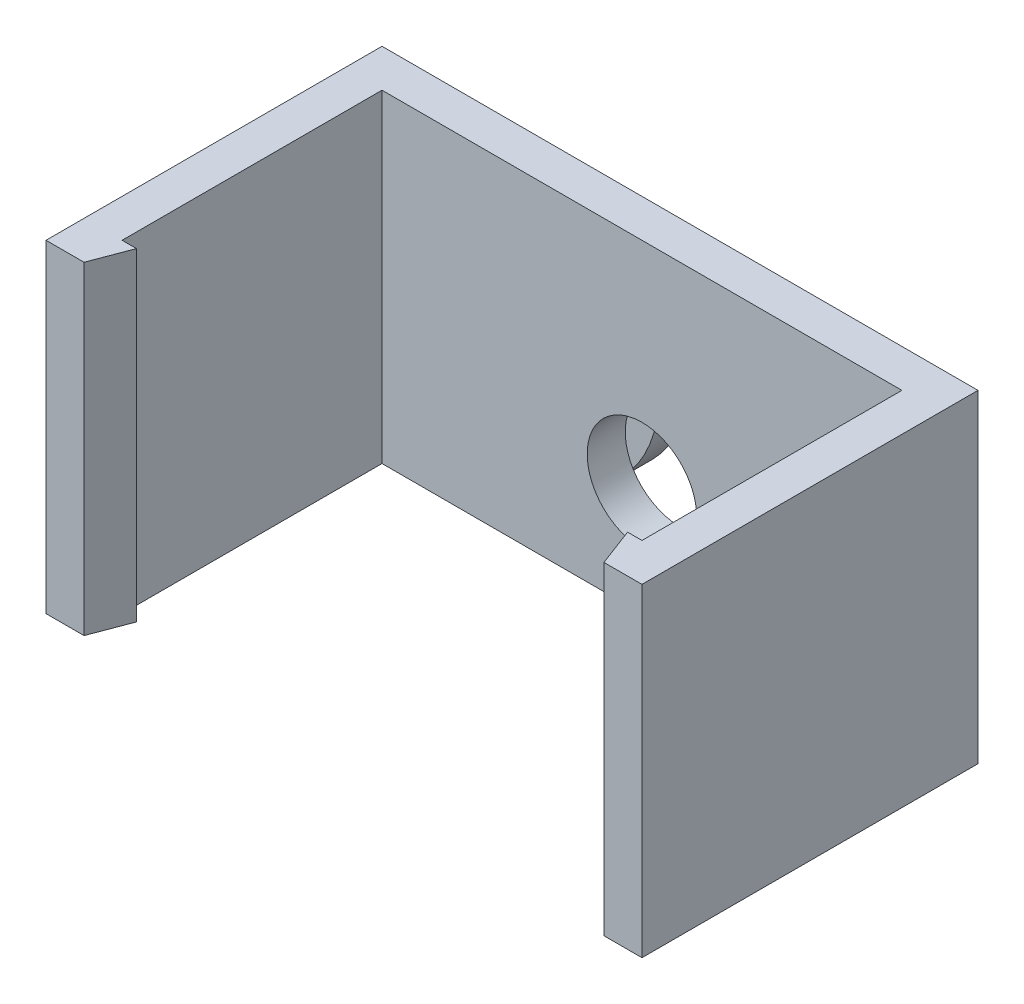
ISO-10303-21;
HEADER;
FILE_DESCRIPTION(('STEP AP214'),'2;1');
FILE_NAME('part.step','',(''),(''),'','','');
FILE_SCHEMA(('AUTOMOTIVE_DESIGN { 1 0 10303 214 1 1 1 1 }'));
ENDSEC;
DATA;
#1=APPLICATION_CONTEXT('core data for automotive mechanical design processes');
#2=APPLICATION_PROTOCOL_DEFINITION('international standard','automotive_design',2000,#1);
#3=PRODUCT_CONTEXT('',#1,'mechanical');
#4=PRODUCT('Part','Part','',(#3));
#5=PRODUCT_RELATED_PRODUCT_CATEGORY('part','',(#4));
#6=PRODUCT_DEFINITION_FORMATION('','',#4);
#7=PRODUCT_DEFINITION_CONTEXT('part definition',#1,'design');
#8=PRODUCT_DEFINITION('design','',#6,#7);
#9=PRODUCT_DEFINITION_SHAPE('','',#8);
#10=(LENGTH_UNIT() NAMED_UNIT(*) SI_UNIT(.MILLI.,.METRE.));
#11=(NAMED_UNIT(*) PLANE_ANGLE_UNIT() SI_UNIT($,.RADIAN.));
#12=(NAMED_UNIT(*) SI_UNIT($,.STERADIAN.) SOLID_ANGLE_UNIT());
#13=UNCERTAINTY_MEASURE_WITH_UNIT(LENGTH_MEASURE(1.E-05),#10,'distance_accuracy_value','');
#14=(GEOMETRIC_REPRESENTATION_CONTEXT(3) GLOBAL_UNCERTAINTY_ASSIGNED_CONTEXT((#13)) GLOBAL_UNIT_ASSIGNED_CONTEXT((#10,
#11,#12)) REPRESENTATION_CONTEXT('',''));
#15=CARTESIAN_POINT('',(0.,0.,0.));
#16=DIRECTION('',(0.,0.,1.));
#17=DIRECTION('',(1.,0.,0.));
#18=AXIS2_PLACEMENT_3D('',#15,#16,#17);
#19=CARTESIAN_POINT('',(-27.8509607345382,23.,-13.25));
#20=DIRECTION('',(0.,1.,0.));
#21=DIRECTION('',(0.,0.,1.));
#22=AXIS2_PLACEMENT_3D('',#19,#20,#21);
#23=PLANE('',#22);
#24=DIRECTION('',(-1.,0.,0.));
#25=VECTOR('',#24,1.);
#26=CARTESIAN_POINT('',(-17.1490392654618,23.,-15.85));
#27=LINE('',#26,#25);
#28=CARTESIAN_POINT('',(17.1490392654618,23.,-15.85));
#29=VERTEX_POINT('',#28);
#30=CARTESIAN_POINT('',(-17.1490392654618,23.,-15.85));
#31=VERTEX_POINT('',#30);
#32=EDGE_CURVE('E327',#29,#31,#27,.T.);
#33=ORIENTED_EDGE('',*,*,#32,.F.);
#34=DIRECTION('',(0.,0.,1.));
#35=VECTOR('',#34,1.);
#36=CARTESIAN_POINT('',(17.1490392654618,23.,-13.25));
#37=LINE('',#36,#35);
#38=CARTESIAN_POINT('',(17.1490392654618,23.,-13.25));
#39=VERTEX_POINT('',#38);
#40=EDGE_CURVE('E295',#29,#39,#37,.T.);
#41=ORIENTED_EDGE('',*,*,#40,.T.);
#42=DIRECTION('',(1.,0.,0.));
#43=VECTOR('',#42,1.);
#44=CARTESIAN_POINT('',(-27.8509607345382,23.,-13.25));
#45=LINE('',#44,#43);
#46=CARTESIAN_POINT('',(-17.1490392654618,23.,-13.25));
#47=VERTEX_POINT('',#46);
#48=EDGE_CURVE('E289',#47,#39,#45,.T.);
#49=ORIENTED_EDGE('',*,*,#48,.F.);
#50=DIRECTION('',(0.,0.,1.));
#51=VECTOR('',#50,1.);
#52=CARTESIAN_POINT('',(-17.1490392654618,23.,-23.25));
#53=LINE('',#52,#51);
#54=EDGE_CURVE('E290',#31,#47,#53,.T.);
#55=ORIENTED_EDGE('',*,*,#54,.F.);
#56=EDGE_LOOP('',(#33,#41,#49,#55));
#57=FACE_BOUND('',#56,.T.);
#58=ADVANCED_FACE('F32',(#57),#23,.F.);
#59=CARTESIAN_POINT('',(17.1490392654618,5.49999999999999,-23.25));
#60=DIRECTION('',(0.,1.,0.));
#61=DIRECTION('',(0.,0.,1.));
#62=AXIS2_PLACEMENT_3D('',#59,#60,#61);
#63=PLANE('',#62);
#64=DIRECTION('',(0.,0.,1.));
#65=VECTOR('',#64,1.);
#66=CARTESIAN_POINT('',(14.2647927675116,5.49999999999999,-23.25));
#67=LINE('',#66,#65);
#68=CARTESIAN_POINT('',(14.2647927675117,5.49999999999999,-15.85));
#69=VERTEX_POINT('',#68);
#70=CARTESIAN_POINT('',(14.2647927675116,5.49999999999999,-18.25));
#71=VERTEX_POINT('',#70);
#72=EDGE_CURVE('E198',#69,#71,#67,.F.);
#73=ORIENTED_EDGE('',*,*,#72,.T.);
#74=DIRECTION('',(1.,0.,0.));
#75=VECTOR('',#74,1.);
#76=CARTESIAN_POINT('',(-22.2509607345382,5.49999999999999,-18.25));
#77=LINE('',#76,#75);
#78=CARTESIAN_POINT('',(17.1490392654618,5.49999999999999,-18.25));
#79=VERTEX_POINT('',#78);
#80=EDGE_CURVE('E184',#71,#79,#77,.T.);
#81=ORIENTED_EDGE('',*,*,#80,.T.);
#82=DIRECTION('',(0.,0.,1.));
#83=VECTOR('',#82,1.);
#84=CARTESIAN_POINT('',(17.1490392654618,5.49999999999999,-23.25));
#85=LINE('',#84,#83);
#86=CARTESIAN_POINT('',(17.1490392654618,5.49999999999999,-15.85));
#87=VERTEX_POINT('',#86);
#88=EDGE_CURVE('E196',#79,#87,#85,.T.);
#89=ORIENTED_EDGE('',*,*,#88,.T.);
#90=DIRECTION('',(1.,0.,0.));
#91=VECTOR('',#90,1.);
#92=CARTESIAN_POINT('',(17.1490392654618,5.49999999999999,-15.85));
#93=LINE('',#92,#91);
#94=EDGE_CURVE('E331',#69,#87,#93,.T.);
#95=ORIENTED_EDGE('',*,*,#94,.F.);
#96=EDGE_LOOP('',(#73,#81,#89,#95));
#97=FACE_BOUND('',#96,.T.);
#98=ADVANCED_FACE('F194',(#97),#63,.F.);
#99=CARTESIAN_POINT('',(-23.5,31.,-13.25));
#100=DIRECTION('',(0.,0.,1.));
#101=DIRECTION('',(1.,0.,0.));
#102=AXIS2_PLACEMENT_3D('',#99,#100,#101);
#103=PLANE('',#102);
#104=CARTESIAN_POINT('',(0.,14.25,-13.25));
#105=DIRECTION('',(0.,0.,1.));
#106=DIRECTION('',(1.,0.,0.));
#107=AXIS2_PLACEMENT_3D('',#104,#105,#106);
#108=CIRCLE('',#107,4.31945574035728);
#109=CARTESIAN_POINT('',(4.31945574035728,14.25,-13.25));
#110=VERTEX_POINT('',#109);
#111=EDGE_CURVE('E297',#110,#110,#108,.F.);
#112=ORIENTED_EDGE('',*,*,#111,.F.);
#113=EDGE_LOOP('',(#112));
#114=FACE_BOUND('',#113,.T.);
#115=DIRECTION('',(0.,-1.,0.));
#116=VECTOR('',#115,1.);
#117=CARTESIAN_POINT('',(23.5,31.,-13.25));
#118=LINE('',#117,#116);
#119=CARTESIAN_POINT('',(23.5,31.,-13.25));
#120=VERTEX_POINT('',#119);
#121=CARTESIAN_POINT('',(23.5,5.49999999999999,-13.25));
#122=VERTEX_POINT('',#121);
#123=EDGE_CURVE('E259',#120,#122,#118,.T.);
#124=ORIENTED_EDGE('',*,*,#123,.T.);
#125=DIRECTION('',(1.,0.,0.));
#126=VECTOR('',#125,1.);
#127=CARTESIAN_POINT('',(-31.5,5.49999999999999,-13.25));
#128=LINE('',#127,#126);
#129=CARTESIAN_POINT('',(-23.5,5.49999999999999,-13.25));
#130=VERTEX_POINT('',#129);
#131=EDGE_CURVE('E320',#130,#122,#128,.T.);
#132=ORIENTED_EDGE('',*,*,#131,.F.);
#133=DIRECTION('',(0.,-1.,0.));
#134=VECTOR('',#133,1.);
#135=CARTESIAN_POINT('',(-23.5,31.,-13.25));
#136=LINE('',#135,#134);
#137=CARTESIAN_POINT('',(-23.5,31.,-13.25));
#138=VERTEX_POINT('',#137);
#139=EDGE_CURVE('E268',#138,#130,#136,.T.);
#140=ORIENTED_EDGE('',*,*,#139,.F.);
#141=DIRECTION('',(-1.,0.,0.));
#142=VECTOR('',#141,1.);
#143=CARTESIAN_POINT('',(-23.5,31.,-13.25));
#144=LINE('',#143,#142);
#145=EDGE_CURVE('E248',#120,#138,#144,.T.);
#146=ORIENTED_EDGE('',*,*,#145,.F.);
#147=EDGE_LOOP('',(#124,#132,#140,#146));
#148=FACE_BOUND('',#147,.T.);
#149=DIRECTION('',(0.,-1.,0.));
#150=VECTOR('',#149,1.);
#151=CARTESIAN_POINT('',(17.1490392654618,5.49999999999999,-13.25));
#152=LINE('',#151,#150);
#153=CARTESIAN_POINT('',(17.1490392654618,30.5,-13.25));
#154=VERTEX_POINT('',#153);
#155=EDGE_CURVE('E47',#154,#39,#152,.T.);
#156=ORIENTED_EDGE('',*,*,#155,.F.);
#157=DIRECTION('',(1.,0.,0.));
#158=VECTOR('',#157,1.);
#159=CARTESIAN_POINT('',(-17.1490392654618,30.5,-13.25));
#160=LINE('',#159,#158);
#161=CARTESIAN_POINT('',(-17.1490392654618,30.5,-13.25));
#162=VERTEX_POINT('',#161);
#163=EDGE_CURVE('E283',#154,#162,#160,.F.);
#164=ORIENTED_EDGE('',*,*,#163,.T.);
#165=DIRECTION('',(0.,1.,0.));
#166=VECTOR('',#165,1.);
#167=CARTESIAN_POINT('',(-17.1490392654618,5.49999999999999,-13.25));
#168=LINE('',#167,#166);
#169=EDGE_CURVE('E54',#47,#162,#168,.T.);
#170=ORIENTED_EDGE('',*,*,#169,.F.);
#171=ORIENTED_EDGE('',*,*,#48,.T.);
#172=EDGE_LOOP('',(#156,#164,#170,#171));
#173=FACE_BOUND('',#172,.T.);
#174=ADVANCED_FACE('F287',(#114,#148,#173),#103,.F.);
#175=CARTESIAN_POINT('',(0.,31.,0.));
#176=DIRECTION('',(0.,-1.,0.));
#177=DIRECTION('',(0.,0.,-1.));
#178=AXIS2_PLACEMENT_3D('',#175,#176,#177);
#179=PLANE('',#178);
#180=DIRECTION('',(0.353543073980112,0.,-0.935418245941725));
#181=VECTOR('',#180,1.);
#182=CARTESIAN_POINT('',(-13.5557335360472,31.,-5.12341482024928));
#183=LINE('',#182,#181);
#184=CARTESIAN_POINT('',(-20.5,31.,13.25));
#185=VERTEX_POINT('',#184);
#186=CARTESIAN_POINT('',(-19.3661443941875,31.,10.25));
#187=VERTEX_POINT('',#186);
#188=EDGE_CURVE('E210',#185,#187,#183,.T.);
#189=ORIENTED_EDGE('',*,*,#188,.T.);
#190=DIRECTION('',(1.,0.,0.));
#191=VECTOR('',#190,1.);
#192=CARTESIAN_POINT('',(-20.5,31.,10.25));
#193=LINE('',#192,#191);
#194=CARTESIAN_POINT('',(-20.5,31.,10.25));
#195=VERTEX_POINT('',#194);
#196=EDGE_CURVE('E233',#195,#187,#193,.T.);
#197=ORIENTED_EDGE('',*,*,#196,.F.);
#198=DIRECTION('',(0.,0.,1.));
#199=VECTOR('',#198,1.);
#200=CARTESIAN_POINT('',(-20.5,31.,-10.25));
#201=LINE('',#200,#199);
#202=CARTESIAN_POINT('',(-20.5,31.,-10.25));
#203=VERTEX_POINT('',#202);
#204=EDGE_CURVE('E229',#203,#195,#201,.T.);
#205=ORIENTED_EDGE('',*,*,#204,.F.);
#206=DIRECTION('',(-1.,0.,0.));
#207=VECTOR('',#206,1.);
#208=CARTESIAN_POINT('',(-20.5,31.,-10.25));
#209=LINE('',#208,#207);
#210=CARTESIAN_POINT('',(20.5,31.,-10.25));
#211=VERTEX_POINT('',#210);
#212=EDGE_CURVE('E227',#211,#203,#209,.T.);
#213=ORIENTED_EDGE('',*,*,#212,.F.);
#214=DIRECTION('',(0.,0.,-1.));
#215=VECTOR('',#214,1.);
#216=CARTESIAN_POINT('',(20.5,31.,-10.25));
#217=LINE('',#216,#215);
#218=CARTESIAN_POINT('',(20.5,31.,10.25));
#219=VERTEX_POINT('',#218);
#220=EDGE_CURVE('E220',#219,#211,#217,.T.);
#221=ORIENTED_EDGE('',*,*,#220,.F.);
#222=CARTESIAN_POINT('',(19.3661443941875,31.,10.25));
#223=VERTEX_POINT('',#222);
#224=EDGE_CURVE('E232',#223,#219,#193,.T.);
#225=ORIENTED_EDGE('',*,*,#224,.F.);
#226=DIRECTION('',(-0.353543073980112,0.,-0.935418245941725));
#227=VECTOR('',#226,1.);
#228=CARTESIAN_POINT('',(13.5557335360472,31.,-5.12341482024927));
#229=LINE('',#228,#227);
#230=CARTESIAN_POINT('',(20.5,31.,13.25));
#231=VERTEX_POINT('',#230);
#232=EDGE_CURVE('E206',#231,#223,#229,.T.);
#233=ORIENTED_EDGE('',*,*,#232,.F.);
#234=DIRECTION('',(1.,0.,0.));
#235=VECTOR('',#234,1.);
#236=CARTESIAN_POINT('',(-23.5,31.,13.25));
#237=LINE('',#236,#235);
#238=CARTESIAN_POINT('',(23.5,31.,13.25));
#239=VERTEX_POINT('',#238);
#240=EDGE_CURVE('E253',#231,#239,#237,.T.);
#241=ORIENTED_EDGE('',*,*,#240,.T.);
#242=DIRECTION('',(0.,0.,-1.));
#243=VECTOR('',#242,1.);
#244=CARTESIAN_POINT('',(23.5,31.,-13.25));
#245=LINE('',#244,#243);
#246=EDGE_CURVE('E257',#239,#120,#245,.T.);
#247=ORIENTED_EDGE('',*,*,#246,.T.);
#248=ORIENTED_EDGE('',*,*,#145,.T.);
#249=DIRECTION('',(0.,0.,1.));
#250=VECTOR('',#249,1.);
#251=CARTESIAN_POINT('',(-23.5,31.,-13.25));
#252=LINE('',#251,#250);
#253=CARTESIAN_POINT('',(-23.5,31.,13.25));
#254=VERTEX_POINT('',#253);
#255=EDGE_CURVE('E251',#138,#254,#252,.T.);
#256=ORIENTED_EDGE('',*,*,#255,.T.);
#257=EDGE_CURVE('E254',#254,#185,#237,.T.);
#258=ORIENTED_EDGE('',*,*,#257,.T.);
#259=EDGE_LOOP('',(#189,#197,#205,#213,#221,#225,#233,#241,#247,#248,#256,#258));
#260=FACE_BOUND('',#259,.T.);
#261=ADVANCED_FACE('F419',(#260),#179,.F.);
#262=CARTESIAN_POINT('',(-23.5,31.,13.25));
#263=DIRECTION('',(0.,0.,-1.));
#264=DIRECTION('',(-1.,0.,0.));
#265=AXIS2_PLACEMENT_3D('',#262,#263,#264);
#266=PLANE('',#265);
#267=DIRECTION('',(0.,-1.,0.));
#268=VECTOR('',#267,1.);
#269=CARTESIAN_POINT('',(-23.5,31.,13.25));
#270=LINE('',#269,#268);
#271=CARTESIAN_POINT('',(-23.5,5.49999999999999,13.25));
#272=VERTEX_POINT('',#271);
#273=EDGE_CURVE('E265',#254,#272,#270,.T.);
#274=ORIENTED_EDGE('',*,*,#273,.T.);
#275=DIRECTION('',(1.,0.,0.));
#276=VECTOR('',#275,1.);
#277=CARTESIAN_POINT('',(-31.5,5.49999999999999,13.25));
#278=LINE('',#277,#276);
#279=CARTESIAN_POINT('',(-20.5,5.49999999999999,13.25));
#280=VERTEX_POINT('',#279);
#281=EDGE_CURVE('E319',#272,#280,#278,.T.);
#282=ORIENTED_EDGE('',*,*,#281,.T.);
#283=DIRECTION('',(0.,1.,0.));
#284=VECTOR('',#283,1.);
#285=CARTESIAN_POINT('',(-20.5,0.,13.25));
#286=LINE('',#285,#284);
#287=EDGE_CURVE('E218',#280,#185,#286,.T.);
#288=ORIENTED_EDGE('',*,*,#287,.T.);
#289=ORIENTED_EDGE('',*,*,#257,.F.);
#290=EDGE_LOOP('',(#274,#282,#288,#289));
#291=FACE_BOUND('',#290,.T.);
#292=ADVANCED_FACE('F422',(#291),#266,.F.);
#293=CARTESIAN_POINT('',(-20.5,31.,10.25));
#294=DIRECTION('',(0.,0.,-1.));
#295=DIRECTION('',(-1.,0.,0.));
#296=AXIS2_PLACEMENT_3D('',#293,#294,#295);
#297=PLANE('',#296);
#298=DIRECTION('',(1.,0.,0.));
#299=VECTOR('',#298,1.);
#300=CARTESIAN_POINT('',(-20.5,5.49999999999999,10.25));
#301=LINE('',#300,#299);
#302=CARTESIAN_POINT('',(-20.5,5.49999999999999,10.25));
#303=VERTEX_POINT('',#302);
#304=CARTESIAN_POINT('',(-19.3661443941875,5.49999999999999,10.25));
#305=VERTEX_POINT('',#304);
#306=EDGE_CURVE('E317',#303,#305,#301,.T.);
#307=ORIENTED_EDGE('',*,*,#306,.F.);
#308=DIRECTION('',(0.,-1.,0.));
#309=VECTOR('',#308,1.);
#310=CARTESIAN_POINT('',(-20.5,31.,10.25));
#311=LINE('',#310,#309);
#312=EDGE_CURVE('E239',#195,#303,#311,.T.);
#313=ORIENTED_EDGE('',*,*,#312,.F.);
#314=ORIENTED_EDGE('',*,*,#196,.T.);
#315=DIRECTION('',(0.,1.,0.));
#316=VECTOR('',#315,1.);
#317=CARTESIAN_POINT('',(-19.3661443941875,0.,10.25));
#318=LINE('',#317,#316);
#319=EDGE_CURVE('E221',#305,#187,#318,.T.);
#320=ORIENTED_EDGE('',*,*,#319,.F.);
#321=EDGE_LOOP('',(#307,#313,#314,#320));
#322=FACE_BOUND('',#321,.T.);
#323=ADVANCED_FACE('F406',(#322),#297,.T.);
#324=CARTESIAN_POINT('',(-23.5,31.,-13.25));
#325=DIRECTION('',(1.,0.,0.));
#326=DIRECTION('',(0.,0.,-1.));
#327=AXIS2_PLACEMENT_3D('',#324,#325,#326);
#328=PLANE('',#327);
#329=ORIENTED_EDGE('',*,*,#139,.T.);
#330=DIRECTION('',(0.,0.,1.));
#331=VECTOR('',#330,1.);
#332=CARTESIAN_POINT('',(-23.5,5.49999999999999,-13.25));
#333=LINE('',#332,#331);
#334=EDGE_CURVE('E303',#130,#272,#333,.T.);
#335=ORIENTED_EDGE('',*,*,#334,.T.);
#336=ORIENTED_EDGE('',*,*,#273,.F.);
#337=ORIENTED_EDGE('',*,*,#255,.F.);
#338=EDGE_LOOP('',(#329,#335,#336,#337));
#339=FACE_BOUND('',#338,.T.);
#340=ADVANCED_FACE('F430',(#339),#328,.F.);
#341=DIRECTION('',(0.,1.,0.));
#342=VECTOR('',#341,1.);
#343=CARTESIAN_POINT('',(20.5,0.,13.25));
#344=LINE('',#343,#342);
#345=CARTESIAN_POINT('',(20.5,5.49999999999999,13.25));
#346=VERTEX_POINT('',#345);
#347=EDGE_CURVE('E217',#346,#231,#344,.T.);
#348=ORIENTED_EDGE('',*,*,#347,.F.);
#349=CARTESIAN_POINT('',(23.5,5.49999999999999,13.25));
#350=VERTEX_POINT('',#349);
#351=EDGE_CURVE('E322',#346,#350,#278,.T.);
#352=ORIENTED_EDGE('',*,*,#351,.T.);
#353=DIRECTION('',(0.,-1.,0.));
#354=VECTOR('',#353,1.);
#355=CARTESIAN_POINT('',(23.5,31.,13.25));
#356=LINE('',#355,#354);
#357=EDGE_CURVE('E262',#239,#350,#356,.T.);
#358=ORIENTED_EDGE('',*,*,#357,.F.);
#359=ORIENTED_EDGE('',*,*,#240,.F.);
#360=EDGE_LOOP('',(#348,#352,#358,#359));
#361=FACE_BOUND('',#360,.T.);
#362=ADVANCED_FACE('F426',(#361),#266,.F.);
#363=CARTESIAN_POINT('',(23.5,31.,-13.25));
#364=DIRECTION('',(-1.,0.,0.));
#365=DIRECTION('',(0.,0.,1.));
#366=AXIS2_PLACEMENT_3D('',#363,#364,#365);
#367=PLANE('',#366);
#368=ORIENTED_EDGE('',*,*,#357,.T.);
#369=DIRECTION('',(0.,0.,1.));
#370=VECTOR('',#369,1.);
#371=CARTESIAN_POINT('',(23.5,5.49999999999999,-13.25));
#372=LINE('',#371,#370);
#373=EDGE_CURVE('E323',#122,#350,#372,.T.);
#374=ORIENTED_EDGE('',*,*,#373,.F.);
#375=ORIENTED_EDGE('',*,*,#123,.F.);
#376=ORIENTED_EDGE('',*,*,#246,.F.);
#377=EDGE_LOOP('',(#368,#374,#375,#376));
#378=FACE_BOUND('',#377,.T.);
#379=ADVANCED_FACE('F417',(#378),#367,.F.);
#380=CARTESIAN_POINT('',(20.5,31.,-10.25));
#381=DIRECTION('',(-1.,0.,0.));
#382=DIRECTION('',(0.,0.,1.));
#383=AXIS2_PLACEMENT_3D('',#380,#381,#382);
#384=PLANE('',#383);
#385=DIRECTION('',(0.,0.,-1.));
#386=VECTOR('',#385,1.);
#387=CARTESIAN_POINT('',(20.5,5.49999999999999,-10.25));
#388=LINE('',#387,#386);
#389=CARTESIAN_POINT('',(20.5,5.49999999999999,10.25));
#390=VERTEX_POINT('',#389);
#391=CARTESIAN_POINT('',(20.5,5.49999999999999,-10.25));
#392=VERTEX_POINT('',#391);
#393=EDGE_CURVE('E311',#390,#392,#388,.T.);
#394=ORIENTED_EDGE('',*,*,#393,.F.);
#395=DIRECTION('',(0.,-1.,0.));
#396=VECTOR('',#395,1.);
#397=CARTESIAN_POINT('',(20.5,31.,10.25));
#398=LINE('',#397,#396);
#399=EDGE_CURVE('E236',#219,#390,#398,.T.);
#400=ORIENTED_EDGE('',*,*,#399,.F.);
#401=ORIENTED_EDGE('',*,*,#220,.T.);
#402=DIRECTION('',(0.,-1.,0.));
#403=VECTOR('',#402,1.);
#404=CARTESIAN_POINT('',(20.5,31.,-10.25));
#405=LINE('',#404,#403);
#406=EDGE_CURVE('E245',#211,#392,#405,.T.);
#407=ORIENTED_EDGE('',*,*,#406,.T.);
#408=EDGE_LOOP('',(#394,#400,#401,#407));
#409=FACE_BOUND('',#408,.T.);
#410=ADVANCED_FACE('F413',(#409),#384,.T.);
#411=CARTESIAN_POINT('',(-20.5,31.,-10.25));
#412=DIRECTION('',(0.,0.,1.));
#413=DIRECTION('',(1.,0.,0.));
#414=AXIS2_PLACEMENT_3D('',#411,#412,#413);
#415=PLANE('',#414);
#416=DIRECTION('',(-1.,0.,0.));
#417=VECTOR('',#416,1.);
#418=CARTESIAN_POINT('',(-20.5,5.49999999999999,-10.25));
#419=LINE('',#418,#417);
#420=CARTESIAN_POINT('',(-20.5,5.49999999999999,-10.25));
#421=VERTEX_POINT('',#420);
#422=EDGE_CURVE('E313',#392,#421,#419,.T.);
#423=ORIENTED_EDGE('',*,*,#422,.F.);
#424=ORIENTED_EDGE('',*,*,#406,.F.);
#425=ORIENTED_EDGE('',*,*,#212,.T.);
#426=DIRECTION('',(0.,-1.,0.));
#427=VECTOR('',#426,1.);
#428=CARTESIAN_POINT('',(-20.5,31.,-10.25));
#429=LINE('',#428,#427);
#430=EDGE_CURVE('E242',#203,#421,#429,.T.);
#431=ORIENTED_EDGE('',*,*,#430,.T.);
#432=EDGE_LOOP('',(#423,#424,#425,#431));
#433=FACE_BOUND('',#432,.T.);
#434=CARTESIAN_POINT('',(0.,14.25,-10.25));
#435=DIRECTION('',(0.,0.,1.));
#436=DIRECTION('',(1.,0.,0.));
#437=AXIS2_PLACEMENT_3D('',#434,#435,#436);
#438=CIRCLE('',#437,4.31945574035728);
#439=CARTESIAN_POINT('',(4.31945574035728,14.25,-10.25));
#440=VERTEX_POINT('',#439);
#441=EDGE_CURVE('E300',#440,#440,#438,.F.);
#442=ORIENTED_EDGE('',*,*,#441,.T.);
#443=EDGE_LOOP('',(#442));
#444=FACE_BOUND('',#443,.T.);
#445=ADVANCED_FACE('F409',(#433,#444),#415,.T.);
#446=CARTESIAN_POINT('',(-20.5,31.,-10.25));
#447=DIRECTION('',(1.,0.,0.));
#448=DIRECTION('',(0.,0.,-1.));
#449=AXIS2_PLACEMENT_3D('',#446,#447,#448);
#450=PLANE('',#449);
#451=DIRECTION('',(0.,0.,1.));
#452=VECTOR('',#451,1.);
#453=CARTESIAN_POINT('',(-20.5,5.49999999999999,-10.25));
#454=LINE('',#453,#452);
#455=EDGE_CURVE('E315',#421,#303,#454,.T.);
#456=ORIENTED_EDGE('',*,*,#455,.F.);
#457=ORIENTED_EDGE('',*,*,#430,.F.);
#458=ORIENTED_EDGE('',*,*,#204,.T.);
#459=ORIENTED_EDGE('',*,*,#312,.T.);
#460=EDGE_LOOP('',(#456,#457,#458,#459));
#461=FACE_BOUND('',#460,.T.);
#462=ADVANCED_FACE('F404',(#461),#450,.T.);
#463=DIRECTION('',(1.,0.,0.));
#464=VECTOR('',#463,1.);
#465=CARTESIAN_POINT('',(-20.5,5.49999999999999,10.25));
#466=LINE('',#465,#464);
#467=CARTESIAN_POINT('',(19.3661443941875,5.49999999999999,10.25));
#468=VERTEX_POINT('',#467);
#469=EDGE_CURVE('E309',#468,#390,#466,.T.);
#470=ORIENTED_EDGE('',*,*,#469,.F.);
#471=DIRECTION('',(0.,1.,0.));
#472=VECTOR('',#471,1.);
#473=CARTESIAN_POINT('',(19.3661443941875,0.,10.25));
#474=LINE('',#473,#472);
#475=EDGE_CURVE('E223',#468,#223,#474,.T.);
#476=ORIENTED_EDGE('',*,*,#475,.T.);
#477=ORIENTED_EDGE('',*,*,#224,.T.);
#478=ORIENTED_EDGE('',*,*,#399,.T.);
#479=EDGE_LOOP('',(#470,#476,#477,#478));
#480=FACE_BOUND('',#479,.T.);
#481=ADVANCED_FACE('F400',(#480),#297,.T.);
#482=CARTESIAN_POINT('',(13.5557335360472,0.,-5.12341482024927));
#483=DIRECTION('',(0.935418245941725,0.,-0.353543073980112));
#484=DIRECTION('',(-0.353543073980112,0.,-0.935418245941725));
#485=AXIS2_PLACEMENT_3D('',#482,#483,#484);
#486=PLANE('',#485);
#487=ORIENTED_EDGE('',*,*,#475,.F.);
#488=DIRECTION('',(0.353543073980112,0.,0.935418245941725));
#489=VECTOR('',#488,1.);
#490=CARTESIAN_POINT('',(13.5557335360472,5.49999999999999,-5.12341482024927));
#491=LINE('',#490,#489);
#492=EDGE_CURVE('E306',#468,#346,#491,.T.);
#493=ORIENTED_EDGE('',*,*,#492,.T.);
#494=ORIENTED_EDGE('',*,*,#347,.T.);
#495=ORIENTED_EDGE('',*,*,#232,.T.);
#496=EDGE_LOOP('',(#487,#493,#494,#495));
#497=FACE_BOUND('',#496,.T.);
#498=ADVANCED_FACE('F396',(#497),#486,.F.);
#499=CARTESIAN_POINT('',(-13.5557335360472,0.,-5.12341482024928));
#500=DIRECTION('',(0.935418245941725,0.,0.353543073980112));
#501=DIRECTION('',(0.353543073980112,0.,-0.935418245941725));
#502=AXIS2_PLACEMENT_3D('',#499,#500,#501);
#503=PLANE('',#502);
#504=DIRECTION('',(-0.353543073980112,0.,0.935418245941725));
#505=VECTOR('',#504,1.);
#506=CARTESIAN_POINT('',(-13.5557335360472,5.49999999999999,-5.12341482024928));
#507=LINE('',#506,#505);
#508=EDGE_CURVE('E279',#305,#280,#507,.T.);
#509=ORIENTED_EDGE('',*,*,#508,.F.);
#510=ORIENTED_EDGE('',*,*,#319,.T.);
#511=ORIENTED_EDGE('',*,*,#188,.F.);
#512=ORIENTED_EDGE('',*,*,#287,.F.);
#513=EDGE_LOOP('',(#509,#510,#511,#512));
#514=FACE_BOUND('',#513,.T.);
#515=ADVANCED_FACE('F393',(#514),#503,.T.);
#516=CARTESIAN_POINT('',(-17.1490392654618,5.49999999999999,-23.25));
#517=DIRECTION('',(1.,0.,0.));
#518=DIRECTION('',(0.,0.,-1.));
#519=AXIS2_PLACEMENT_3D('',#516,#517,#518);
#520=PLANE('',#519);
#521=ORIENTED_EDGE('',*,*,#169,.T.);
#522=CARTESIAN_POINT('',(-17.1490392654618,30.5,-18.25));
#523=DIRECTION('',(1.,0.,0.));
#524=DIRECTION('',(0.,0.,-1.));
#525=AXIS2_PLACEMENT_3D('',#522,#523,#524);
#526=CIRCLE('',#525,5.);
#527=CARTESIAN_POINT('',(-17.1490392654618,25.5,-18.25));
#528=VERTEX_POINT('',#527);
#529=EDGE_CURVE('E11',#162,#528,#526,.T.);
#530=ORIENTED_EDGE('',*,*,#529,.T.);
#531=DIRECTION('',(0.,-1.,0.));
#532=VECTOR('',#531,1.);
#533=CARTESIAN_POINT('',(-17.1490392654618,5.49999999999999,-18.25));
#534=LINE('',#533,#532);
#535=CARTESIAN_POINT('',(-17.1490392654618,5.49999999999999,-18.25));
#536=VERTEX_POINT('',#535);
#537=EDGE_CURVE('E348',#528,#536,#534,.T.);
#538=ORIENTED_EDGE('',*,*,#537,.T.);
#539=DIRECTION('',(0.,0.,1.));
#540=VECTOR('',#539,1.);
#541=CARTESIAN_POINT('',(-17.1490392654618,5.49999999999999,-23.25));
#542=LINE('',#541,#540);
#543=CARTESIAN_POINT('',(-17.1490392654618,5.49999999999999,-15.85));
#544=VERTEX_POINT('',#543);
#545=EDGE_CURVE('E207',#536,#544,#542,.T.);
#546=ORIENTED_EDGE('',*,*,#545,.T.);
#547=DIRECTION('',(0.,-1.,0.));
#548=VECTOR('',#547,1.);
#549=CARTESIAN_POINT('',(-17.1490392654618,5.49999999999999,-15.85));
#550=LINE('',#549,#548);
#551=EDGE_CURVE('E345',#31,#544,#550,.T.);
#552=ORIENTED_EDGE('',*,*,#551,.F.);
#553=ORIENTED_EDGE('',*,*,#54,.T.);
#554=EDGE_LOOP('',(#521,#530,#538,#546,#552,#553));
#555=FACE_BOUND('',#554,.T.);
#556=ADVANCED_FACE('F377',(#555),#520,.F.);
#557=CARTESIAN_POINT('',(17.1490392654618,5.49999999999999,-23.25));
#558=DIRECTION('',(-1.,0.,0.));
#559=DIRECTION('',(0.,0.,1.));
#560=AXIS2_PLACEMENT_3D('',#557,#558,#559);
#561=PLANE('',#560);
#562=ORIENTED_EDGE('',*,*,#88,.F.);
#563=DIRECTION('',(0.,-1.,0.));
#564=VECTOR('',#563,1.);
#565=CARTESIAN_POINT('',(17.1490392654618,25.5,-18.25));
#566=LINE('',#565,#564);
#567=CARTESIAN_POINT('',(17.1490392654618,25.5,-18.25));
#568=VERTEX_POINT('',#567);
#569=EDGE_CURVE('E181',#568,#79,#566,.T.);
#570=ORIENTED_EDGE('',*,*,#569,.F.);
#571=CARTESIAN_POINT('',(17.1490392654618,30.5,-18.25));
#572=DIRECTION('',(-1.,0.,0.));
#573=DIRECTION('',(0.,0.,1.));
#574=AXIS2_PLACEMENT_3D('',#571,#572,#573);
#575=CIRCLE('',#574,5.);
#576=EDGE_CURVE('E40',#568,#154,#575,.T.);
#577=ORIENTED_EDGE('',*,*,#576,.T.);
#578=ORIENTED_EDGE('',*,*,#155,.T.);
#579=ORIENTED_EDGE('',*,*,#40,.F.);
#580=DIRECTION('',(0.,1.,0.));
#581=VECTOR('',#580,1.);
#582=CARTESIAN_POINT('',(17.1490392654618,23.,-15.85));
#583=LINE('',#582,#581);
#584=EDGE_CURVE('E205',#87,#29,#583,.T.);
#585=ORIENTED_EDGE('',*,*,#584,.F.);
#586=EDGE_LOOP('',(#562,#570,#577,#578,#579,#585));
#587=FACE_BOUND('',#586,.T.);
#588=ADVANCED_FACE('F202',(#587),#561,.F.);
#589=ORIENTED_EDGE('',*,*,#545,.F.);
#590=CARTESIAN_POINT('',(-14.2647927675116,5.49999999999999,-18.25));
#591=VERTEX_POINT('',#590);
#592=EDGE_CURVE('E199',#536,#591,#77,.T.);
#593=ORIENTED_EDGE('',*,*,#592,.T.);
#594=DIRECTION('',(0.,0.,1.));
#595=VECTOR('',#594,1.);
#596=CARTESIAN_POINT('',(-14.2647927675116,5.49999999999999,-18.25));
#597=LINE('',#596,#595);
#598=CARTESIAN_POINT('',(-14.2647927675115,5.49999999999999,-15.85));
#599=VERTEX_POINT('',#598);
#600=EDGE_CURVE('E276',#591,#599,#597,.T.);
#601=ORIENTED_EDGE('',*,*,#600,.T.);
#602=DIRECTION('',(1.,0.,0.));
#603=VECTOR('',#602,1.);
#604=CARTESIAN_POINT('',(-14.2647927675115,5.49999999999999,-15.85));
#605=LINE('',#604,#603);
#606=EDGE_CURVE('E342',#544,#599,#605,.T.);
#607=ORIENTED_EDGE('',*,*,#606,.F.);
#608=EDGE_LOOP('',(#589,#593,#601,#607));
#609=FACE_BOUND('',#608,.T.);
#610=ADVANCED_FACE('F359',(#609),#63,.F.);
#611=CARTESIAN_POINT('',(0.,14.25,45.75));
#612=DIRECTION('',(0.,0.,-1.));
#613=DIRECTION('',(-1.,0.,0.));
#614=AXIS2_PLACEMENT_3D('',#611,#612,#613);
#615=CYLINDRICAL_SURFACE('',#614,4.31945574035728);
#616=CARTESIAN_POINT('',(0.,14.25,-18.25));
#617=DIRECTION('',(0.,0.,1.));
#618=DIRECTION('',(1.,0.,0.));
#619=AXIS2_PLACEMENT_3D('',#616,#617,#618);
#620=CIRCLE('',#619,4.31945574035728);
#621=CARTESIAN_POINT('',(4.30296668545711,14.6270617943411,-18.25));
#622=VERTEX_POINT('',#621);
#623=CARTESIAN_POINT('',(-4.30296668545712,14.6270617943411,-18.25));
#624=VERTEX_POINT('',#623);
#625=EDGE_CURVE('E353',#622,#624,#620,.T.);
#626=ORIENTED_EDGE('',*,*,#625,.F.);
#627=DIRECTION('',(0.,0.,-1.));
#628=VECTOR('',#627,1.);
#629=CARTESIAN_POINT('',(4.30296668545711,14.6270617943411,45.75));
#630=LINE('',#629,#628);
#631=CARTESIAN_POINT('',(4.30296668545711,14.6270617943411,-15.85));
#632=VERTEX_POINT('',#631);
#633=EDGE_CURVE('E271',#622,#632,#630,.F.);
#634=ORIENTED_EDGE('',*,*,#633,.T.);
#635=CARTESIAN_POINT('',(0.,14.25,-15.85));
#636=DIRECTION('',(0.,0.,-1.));
#637=DIRECTION('',(1.,0.,0.));
#638=AXIS2_PLACEMENT_3D('',#635,#636,#637);
#639=CIRCLE('',#638,4.31945574035729);
#640=CARTESIAN_POINT('',(-4.30296668545712,14.6270617943411,-15.85));
#641=VERTEX_POINT('',#640);
#642=EDGE_CURVE('E336',#641,#632,#639,.T.);
#643=ORIENTED_EDGE('',*,*,#642,.F.);
#644=DIRECTION('',(0.,0.,-1.));
#645=VECTOR('',#644,1.);
#646=CARTESIAN_POINT('',(-4.30296668545712,14.6270617943411,45.75));
#647=LINE('',#646,#645);
#648=EDGE_CURVE('E273',#641,#624,#647,.T.);
#649=ORIENTED_EDGE('',*,*,#648,.T.);
#650=EDGE_LOOP('',(#626,#634,#643,#649));
#651=FACE_BOUND('',#650,.T.);
#652=ADVANCED_FACE('F371',(#651),#615,.F.);
#653=ORIENTED_EDGE('',*,*,#441,.F.);
#654=EDGE_LOOP('',(#653));
#655=FACE_BOUND('',#654,.T.);
#656=ORIENTED_EDGE('',*,*,#111,.T.);
#657=EDGE_LOOP('',(#656));
#658=FACE_BOUND('',#657,.T.);
#659=ADVANCED_FACE('F385',(#655,#658),#615,.F.);
#660=CARTESIAN_POINT('',(-14.2647927675116,15.5,45.75));
#661=DIRECTION('',(0.,0.,-1.));
#662=DIRECTION('',(-1.,0.,0.));
#663=AXIS2_PLACEMENT_3D('',#660,#661,#662);
#664=CYLINDRICAL_SURFACE('',#663,10.);
#665=CARTESIAN_POINT('',(-14.2647927675116,15.5,-18.25));
#666=DIRECTION('',(0.,0.,1.));
#667=DIRECTION('',(1.,0.,0.));
#668=AXIS2_PLACEMENT_3D('',#665,#666,#667);
#669=CIRCLE('',#668,10.);
#670=EDGE_CURVE('E351',#624,#591,#669,.F.);
#671=ORIENTED_EDGE('',*,*,#670,.F.);
#672=ORIENTED_EDGE('',*,*,#648,.F.);
#673=CARTESIAN_POINT('',(-14.2647927675117,15.5000000000001,-15.85));
#674=DIRECTION('',(0.,0.,1.));
#675=DIRECTION('',(-1.,0.,0.));
#676=AXIS2_PLACEMENT_3D('',#673,#674,#675);
#677=CIRCLE('',#676,10.0000000000001);
#678=EDGE_CURVE('E339',#599,#641,#677,.T.);
#679=ORIENTED_EDGE('',*,*,#678,.F.);
#680=ORIENTED_EDGE('',*,*,#600,.F.);
#681=EDGE_LOOP('',(#671,#672,#679,#680));
#682=FACE_BOUND('',#681,.T.);
#683=ADVANCED_FACE('F364',(#682),#664,.T.);
#684=CARTESIAN_POINT('',(14.2647927675116,15.5,45.75));
#685=DIRECTION('',(0.,0.,-1.));
#686=DIRECTION('',(-1.,0.,0.));
#687=AXIS2_PLACEMENT_3D('',#684,#685,#686);
#688=CYLINDRICAL_SURFACE('',#687,10.);
#689=CARTESIAN_POINT('',(14.2647927675116,15.5,-18.25));
#690=DIRECTION('',(0.,0.,1.));
#691=DIRECTION('',(1.,0.,0.));
#692=AXIS2_PLACEMENT_3D('',#689,#690,#691);
#693=CIRCLE('',#692,10.);
#694=EDGE_CURVE('E281',#71,#622,#693,.F.);
#695=ORIENTED_EDGE('',*,*,#694,.F.);
#696=ORIENTED_EDGE('',*,*,#72,.F.);
#697=CARTESIAN_POINT('',(14.2647927675117,15.5000000000001,-15.85));
#698=DIRECTION('',(0.,0.,1.));
#699=DIRECTION('',(-1.,0.,0.));
#700=AXIS2_PLACEMENT_3D('',#697,#698,#699);
#701=CIRCLE('',#700,10.0000000000001);
#702=EDGE_CURVE('E333',#632,#69,#701,.T.);
#703=ORIENTED_EDGE('',*,*,#702,.F.);
#704=ORIENTED_EDGE('',*,*,#633,.F.);
#705=EDGE_LOOP('',(#695,#696,#703,#704));
#706=FACE_BOUND('',#705,.T.);
#707=ADVANCED_FACE('F374',(#706),#688,.T.);
#708=CARTESIAN_POINT('',(-31.5,5.49999999999999,-13.25));
#709=DIRECTION('',(0.,1.,0.));
#710=DIRECTION('',(0.,0.,1.));
#711=AXIS2_PLACEMENT_3D('',#708,#709,#710);
#712=PLANE('',#711);
#713=ORIENTED_EDGE('',*,*,#131,.T.);
#714=ORIENTED_EDGE('',*,*,#373,.T.);
#715=ORIENTED_EDGE('',*,*,#351,.F.);
#716=ORIENTED_EDGE('',*,*,#492,.F.);
#717=ORIENTED_EDGE('',*,*,#469,.T.);
#718=ORIENTED_EDGE('',*,*,#393,.T.);
#719=ORIENTED_EDGE('',*,*,#422,.T.);
#720=ORIENTED_EDGE('',*,*,#455,.T.);
#721=ORIENTED_EDGE('',*,*,#306,.T.);
#722=ORIENTED_EDGE('',*,*,#508,.T.);
#723=ORIENTED_EDGE('',*,*,#281,.F.);
#724=ORIENTED_EDGE('',*,*,#334,.F.);
#725=EDGE_LOOP('',(#713,#714,#715,#716,#717,#718,#719,#720,#721,#722,#723,#724));
#726=FACE_BOUND('',#725,.T.);
#727=ADVANCED_FACE('F440',(#726),#712,.F.);
#728=CARTESIAN_POINT('',(14.2647927675117,15.5000000000001,-15.85));
#729=DIRECTION('',(0.,0.,-1.));
#730=DIRECTION('',(-1.,0.,0.));
#731=AXIS2_PLACEMENT_3D('',#728,#729,#730);
#732=PLANE('',#731);
#733=ORIENTED_EDGE('',*,*,#551,.T.);
#734=ORIENTED_EDGE('',*,*,#606,.T.);
#735=ORIENTED_EDGE('',*,*,#678,.T.);
#736=ORIENTED_EDGE('',*,*,#642,.T.);
#737=ORIENTED_EDGE('',*,*,#702,.T.);
#738=ORIENTED_EDGE('',*,*,#94,.T.);
#739=ORIENTED_EDGE('',*,*,#584,.T.);
#740=ORIENTED_EDGE('',*,*,#32,.T.);
#741=EDGE_LOOP('',(#733,#734,#735,#736,#737,#738,#739,#740));
#742=FACE_BOUND('',#741,.T.);
#743=ADVANCED_FACE('F367',(#742),#732,.F.);
#744=CARTESIAN_POINT('',(-22.2509607345382,25.5,-18.25));
#745=DIRECTION('',(0.,0.,1.));
#746=DIRECTION('',(1.,0.,0.));
#747=AXIS2_PLACEMENT_3D('',#744,#745,#746);
#748=PLANE('',#747);
#749=DIRECTION('',(1.,0.,0.));
#750=VECTOR('',#749,1.);
#751=CARTESIAN_POINT('',(-22.2509607345382,25.5,-18.25));
#752=LINE('',#751,#750);
#753=EDGE_CURVE('E188',#528,#568,#752,.T.);
#754=ORIENTED_EDGE('',*,*,#753,.T.);
#755=ORIENTED_EDGE('',*,*,#569,.T.);
#756=ORIENTED_EDGE('',*,*,#80,.F.);
#757=ORIENTED_EDGE('',*,*,#694,.T.);
#758=ORIENTED_EDGE('',*,*,#625,.T.);
#759=ORIENTED_EDGE('',*,*,#670,.T.);
#760=ORIENTED_EDGE('',*,*,#592,.F.);
#761=ORIENTED_EDGE('',*,*,#537,.F.);
#762=EDGE_LOOP('',(#754,#755,#756,#757,#758,#759,#760,#761));
#763=FACE_BOUND('',#762,.T.);
#764=ADVANCED_FACE('F183',(#763),#748,.F.);
#765=CARTESIAN_POINT('',(17.1490392654618,30.5,-18.25));
#766=DIRECTION('',(-1.,0.,0.));
#767=DIRECTION('',(0.,0.,1.));
#768=AXIS2_PLACEMENT_3D('',#765,#766,#767);
#769=CYLINDRICAL_SURFACE('',#768,5.);
#770=ORIENTED_EDGE('',*,*,#529,.F.);
#771=ORIENTED_EDGE('',*,*,#163,.F.);
#772=ORIENTED_EDGE('',*,*,#576,.F.);
#773=ORIENTED_EDGE('',*,*,#753,.F.);
#774=EDGE_LOOP('',(#770,#771,#772,#773));
#775=FACE_BOUND('',#774,.T.);
#776=ADVANCED_FACE('F34',(#775),#769,.F.);
#777=CLOSED_SHELL('',(#58,#98,#174,#261,#292,#323,#340,#362,#379,#410,#445,#462,#481,#498,#515,
#556,#588,#610,#652,#659,#683,#707,#727,#743,#764,#776));
#778=MANIFOLD_SOLID_BREP('B2',#777);
#779=ADVANCED_BREP_SHAPE_REPRESENTATION('',(#18,#778),#14);
#780=SHAPE_DEFINITION_REPRESENTATION(#9,#779);
ENDSEC;
END-ISO-10303-21;
